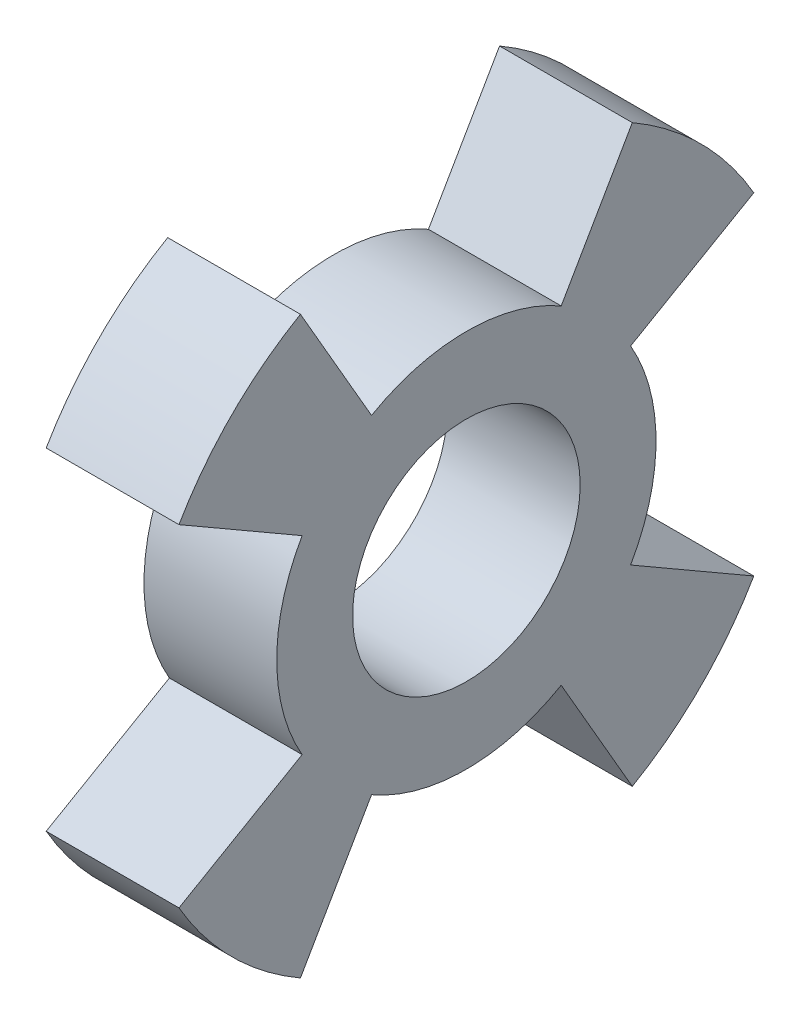
ISO-10303-21;
HEADER;
FILE_DESCRIPTION(('STEP AP214'),'2;1');
FILE_NAME('part.step','',(''),(''),'','','');
FILE_SCHEMA(('AUTOMOTIVE_DESIGN { 1 0 10303 214 1 1 1 1 }'));
ENDSEC;
DATA;
#1=APPLICATION_CONTEXT('core data for automotive mechanical design processes');
#2=APPLICATION_PROTOCOL_DEFINITION('international standard','automotive_design',2000,#1);
#3=PRODUCT_CONTEXT('',#1,'mechanical');
#4=PRODUCT('Part','Part','',(#3));
#5=PRODUCT_RELATED_PRODUCT_CATEGORY('part','',(#4));
#6=PRODUCT_DEFINITION_FORMATION('','',#4);
#7=PRODUCT_DEFINITION_CONTEXT('part definition',#1,'design');
#8=PRODUCT_DEFINITION('design','',#6,#7);
#9=PRODUCT_DEFINITION_SHAPE('','',#8);
#10=(LENGTH_UNIT() NAMED_UNIT(*) SI_UNIT(.MILLI.,.METRE.));
#11=(NAMED_UNIT(*) PLANE_ANGLE_UNIT() SI_UNIT($,.RADIAN.));
#12=(NAMED_UNIT(*) SI_UNIT($,.STERADIAN.) SOLID_ANGLE_UNIT());
#13=UNCERTAINTY_MEASURE_WITH_UNIT(LENGTH_MEASURE(1.E-05),#10,'distance_accuracy_value','');
#14=(GEOMETRIC_REPRESENTATION_CONTEXT(3) GLOBAL_UNCERTAINTY_ASSIGNED_CONTEXT((#13)) GLOBAL_UNIT_ASSIGNED_CONTEXT((#10,
#11,#12)) REPRESENTATION_CONTEXT('',''));
#15=CARTESIAN_POINT('',(0.,0.,0.));
#16=DIRECTION('',(0.,0.,1.));
#17=DIRECTION('',(1.,0.,0.));
#18=AXIS2_PLACEMENT_3D('',#15,#16,#17);
#19=CARTESIAN_POINT('',(14.,0.,0.));
#20=DIRECTION('',(-1.,0.,0.));
#21=DIRECTION('',(0.,0.,1.));
#22=AXIS2_PLACEMENT_3D('',#19,#20,#21);
#23=CYLINDRICAL_SURFACE('',#22,35.);
#24=DIRECTION('',(-1.,0.,0.));
#25=VECTOR('',#24,1.);
#26=CARTESIAN_POINT('',(14.,-30.3108891324554,-17.5));
#27=LINE('',#26,#25);
#28=CARTESIAN_POINT('',(14.,-30.3108891324554,-17.5));
#29=VERTEX_POINT('',#28);
#30=CARTESIAN_POINT('',(0.,-30.3108891324554,-17.5));
#31=VERTEX_POINT('',#30);
#32=EDGE_CURVE('E239',#29,#31,#27,.T.);
#33=ORIENTED_EDGE('',*,*,#32,.T.);
#34=CARTESIAN_POINT('',(0.,0.,0.));
#35=DIRECTION('',(1.,0.,0.));
#36=DIRECTION('',(0.,0.,-1.));
#37=AXIS2_PLACEMENT_3D('',#34,#35,#36);
#38=CIRCLE('',#37,35.);
#39=CARTESIAN_POINT('',(0.,-17.5,-30.3108891324554));
#40=VERTEX_POINT('',#39);
#41=EDGE_CURVE('E183',#31,#40,#38,.T.);
#42=ORIENTED_EDGE('',*,*,#41,.T.);
#43=DIRECTION('',(-1.,0.,0.));
#44=VECTOR('',#43,1.);
#45=CARTESIAN_POINT('',(14.,-17.5,-30.3108891324553));
#46=LINE('',#45,#44);
#47=CARTESIAN_POINT('',(14.,-17.5,-30.3108891324553));
#48=VERTEX_POINT('',#47);
#49=EDGE_CURVE('E50',#48,#40,#46,.T.);
#50=ORIENTED_EDGE('',*,*,#49,.F.);
#51=CARTESIAN_POINT('',(14.,0.,0.));
#52=DIRECTION('',(1.,0.,0.));
#53=DIRECTION('',(0.,0.,-1.));
#54=AXIS2_PLACEMENT_3D('',#51,#52,#53);
#55=CIRCLE('',#54,35.);
#56=EDGE_CURVE('E43',#29,#48,#55,.T.);
#57=ORIENTED_EDGE('',*,*,#56,.F.);
#58=EDGE_LOOP('',(#33,#42,#50,#57));
#59=FACE_BOUND('',#58,.T.);
#60=ADVANCED_FACE('F33',(#59),#23,.T.);
#61=DIRECTION('',(-1.,0.,0.));
#62=VECTOR('',#61,1.);
#63=CARTESIAN_POINT('',(14.,-30.3108891324553,17.5));
#64=LINE('',#63,#62);
#65=CARTESIAN_POINT('',(14.,-30.3108891324553,17.5));
#66=VERTEX_POINT('',#65);
#67=CARTESIAN_POINT('',(0.,-30.3108891324554,17.5));
#68=VERTEX_POINT('',#67);
#69=EDGE_CURVE('E58',#66,#68,#64,.T.);
#70=ORIENTED_EDGE('',*,*,#69,.F.);
#71=CARTESIAN_POINT('',(14.,-17.5,30.3108891324553));
#72=VERTEX_POINT('',#71);
#73=EDGE_CURVE('E169',#72,#66,#55,.T.);
#74=ORIENTED_EDGE('',*,*,#73,.F.);
#75=DIRECTION('',(-1.,0.,0.));
#76=VECTOR('',#75,1.);
#77=CARTESIAN_POINT('',(14.,-17.5,30.3108891324553));
#78=LINE('',#77,#76);
#79=CARTESIAN_POINT('',(0.,-17.5,30.3108891324553));
#80=VERTEX_POINT('',#79);
#81=EDGE_CURVE('E149',#72,#80,#78,.T.);
#82=ORIENTED_EDGE('',*,*,#81,.T.);
#83=EDGE_CURVE('E189',#80,#68,#38,.T.);
#84=ORIENTED_EDGE('',*,*,#83,.T.);
#85=EDGE_LOOP('',(#70,#74,#82,#84));
#86=FACE_BOUND('',#85,.T.);
#87=ADVANCED_FACE('F174',(#86),#23,.T.);
#88=DIRECTION('',(-1.,0.,0.));
#89=VECTOR('',#88,1.);
#90=CARTESIAN_POINT('',(14.,17.5,-30.3108891324553));
#91=LINE('',#90,#89);
#92=CARTESIAN_POINT('',(14.,17.5,-30.3108891324553));
#93=VERTEX_POINT('',#92);
#94=CARTESIAN_POINT('',(0.,17.5,-30.3108891324553));
#95=VERTEX_POINT('',#94);
#96=EDGE_CURVE('E218',#93,#95,#91,.T.);
#97=ORIENTED_EDGE('',*,*,#96,.T.);
#98=CARTESIAN_POINT('',(0.,30.3108891324554,-17.5));
#99=VERTEX_POINT('',#98);
#100=EDGE_CURVE('E177',#95,#99,#38,.T.);
#101=ORIENTED_EDGE('',*,*,#100,.T.);
#102=DIRECTION('',(-1.,0.,0.));
#103=VECTOR('',#102,1.);
#104=CARTESIAN_POINT('',(14.,30.3108891324553,-17.5));
#105=LINE('',#104,#103);
#106=CARTESIAN_POINT('',(14.,30.3108891324553,-17.5));
#107=VERTEX_POINT('',#106);
#108=EDGE_CURVE('E203',#107,#99,#105,.T.);
#109=ORIENTED_EDGE('',*,*,#108,.F.);
#110=EDGE_CURVE('E11',#93,#107,#55,.T.);
#111=ORIENTED_EDGE('',*,*,#110,.F.);
#112=EDGE_LOOP('',(#97,#101,#109,#111));
#113=FACE_BOUND('',#112,.T.);
#114=ADVANCED_FACE('F302',(#113),#23,.T.);
#115=DIRECTION('',(-1.,0.,0.));
#116=VECTOR('',#115,1.);
#117=CARTESIAN_POINT('',(14.,17.5,30.3108891324553));
#118=LINE('',#117,#116);
#119=CARTESIAN_POINT('',(14.,17.5,30.3108891324553));
#120=VERTEX_POINT('',#119);
#121=CARTESIAN_POINT('',(0.,17.5,30.3108891324554));
#122=VERTEX_POINT('',#121);
#123=EDGE_CURVE('E266',#120,#122,#118,.T.);
#124=ORIENTED_EDGE('',*,*,#123,.F.);
#125=CARTESIAN_POINT('',(14.,30.3108891324553,17.5));
#126=VERTEX_POINT('',#125);
#127=EDGE_CURVE('E41',#126,#120,#55,.T.);
#128=ORIENTED_EDGE('',*,*,#127,.F.);
#129=DIRECTION('',(-1.,0.,0.));
#130=VECTOR('',#129,1.);
#131=CARTESIAN_POINT('',(14.,30.3108891324553,17.5));
#132=LINE('',#131,#130);
#133=CARTESIAN_POINT('',(0.,30.3108891324553,17.5));
#134=VERTEX_POINT('',#133);
#135=EDGE_CURVE('E179',#126,#134,#132,.T.);
#136=ORIENTED_EDGE('',*,*,#135,.T.);
#137=EDGE_CURVE('E182',#134,#122,#38,.T.);
#138=ORIENTED_EDGE('',*,*,#137,.T.);
#139=EDGE_LOOP('',(#124,#128,#136,#138));
#140=FACE_BOUND('',#139,.T.);
#141=ADVANCED_FACE('F298',(#140),#23,.T.);
#142=CARTESIAN_POINT('',(14.,0.,0.));
#143=DIRECTION('',(1.,0.,0.));
#144=DIRECTION('',(0.,0.,-1.));
#145=AXIS2_PLACEMENT_3D('',#142,#143,#144);
#146=PLANE('',#145);
#147=CARTESIAN_POINT('',(14.,0.,0.));
#148=DIRECTION('',(1.,0.,0.));
#149=DIRECTION('',(0.,0.,-1.));
#150=AXIS2_PLACEMENT_3D('',#147,#148,#149);
#151=CIRCLE('',#150,12.);
#152=CARTESIAN_POINT('',(14.,0.,-12.));
#153=VERTEX_POINT('',#152);
#154=EDGE_CURVE('E277',#153,#153,#151,.T.);
#155=ORIENTED_EDGE('',*,*,#154,.F.);
#156=EDGE_LOOP('',(#155));
#157=FACE_BOUND('',#156,.T.);
#158=CARTESIAN_POINT('',(14.,0.,0.));
#159=DIRECTION('',(-1.,0.,0.));
#160=DIRECTION('',(0.,0.,-1.));
#161=AXIS2_PLACEMENT_3D('',#158,#159,#160);
#162=CIRCLE('',#161,20.);
#163=CARTESIAN_POINT('',(14.,-17.3205080756888,-10.));
#164=VERTEX_POINT('',#163);
#165=CARTESIAN_POINT('',(14.,-17.3205080756888,10.));
#166=VERTEX_POINT('',#165);
#167=EDGE_CURVE('E260',#164,#166,#162,.T.);
#168=ORIENTED_EDGE('',*,*,#167,.F.);
#169=DIRECTION('',(0.,0.866025403784439,0.5));
#170=VECTOR('',#169,1.);
#171=CARTESIAN_POINT('',(14.,-30.3108891324554,-17.5));
#172=LINE('',#171,#170);
#173=EDGE_CURVE('E253',#29,#164,#172,.T.);
#174=ORIENTED_EDGE('',*,*,#173,.F.);
#175=ORIENTED_EDGE('',*,*,#56,.T.);
#176=DIRECTION('',(0.,-0.500000000000001,-0.866025403784438));
#177=VECTOR('',#176,1.);
#178=CARTESIAN_POINT('',(14.,-17.5,-30.3108891324553));
#179=LINE('',#178,#177);
#180=CARTESIAN_POINT('',(14.,-10.,-17.3205080756888));
#181=VERTEX_POINT('',#180);
#182=EDGE_CURVE('E229',#181,#48,#179,.T.);
#183=ORIENTED_EDGE('',*,*,#182,.F.);
#184=CARTESIAN_POINT('',(14.,0.,0.));
#185=DIRECTION('',(-1.,0.,0.));
#186=DIRECTION('',(0.,0.,-1.));
#187=AXIS2_PLACEMENT_3D('',#184,#185,#186);
#188=CIRCLE('',#187,20.);
#189=CARTESIAN_POINT('',(14.,10.,-17.3205080756888));
#190=VERTEX_POINT('',#189);
#191=EDGE_CURVE('E241',#190,#181,#188,.T.);
#192=ORIENTED_EDGE('',*,*,#191,.F.);
#193=DIRECTION('',(0.,-0.500000000000001,0.866025403784438));
#194=VECTOR('',#193,1.);
#195=CARTESIAN_POINT('',(14.,17.5,-30.3108891324553));
#196=LINE('',#195,#194);
#197=EDGE_CURVE('E232',#93,#190,#196,.T.);
#198=ORIENTED_EDGE('',*,*,#197,.F.);
#199=ORIENTED_EDGE('',*,*,#110,.T.);
#200=DIRECTION('',(0.,0.866025403784438,-0.500000000000001));
#201=VECTOR('',#200,1.);
#202=CARTESIAN_POINT('',(14.,30.3108891324553,-17.5));
#203=LINE('',#202,#201);
#204=CARTESIAN_POINT('',(14.,17.3205080756888,-10.));
#205=VERTEX_POINT('',#204);
#206=EDGE_CURVE('E207',#205,#107,#203,.T.);
#207=ORIENTED_EDGE('',*,*,#206,.F.);
#208=CARTESIAN_POINT('',(14.,0.,0.));
#209=DIRECTION('',(-1.,0.,0.));
#210=DIRECTION('',(0.,0.,-1.));
#211=AXIS2_PLACEMENT_3D('',#208,#209,#210);
#212=CIRCLE('',#211,20.);
#213=CARTESIAN_POINT('',(14.,17.3205080756888,10.));
#214=VERTEX_POINT('',#213);
#215=EDGE_CURVE('E220',#214,#205,#212,.T.);
#216=ORIENTED_EDGE('',*,*,#215,.F.);
#217=DIRECTION('',(0.,-0.866025403784438,-0.500000000000001));
#218=VECTOR('',#217,1.);
#219=CARTESIAN_POINT('',(14.,30.3108891324553,17.5));
#220=LINE('',#219,#218);
#221=EDGE_CURVE('E211',#126,#214,#220,.T.);
#222=ORIENTED_EDGE('',*,*,#221,.F.);
#223=ORIENTED_EDGE('',*,*,#127,.T.);
#224=DIRECTION('',(0.,0.500000000000001,0.866025403784438));
#225=VECTOR('',#224,1.);
#226=CARTESIAN_POINT('',(14.,17.5,30.3108891324553));
#227=LINE('',#226,#225);
#228=CARTESIAN_POINT('',(14.,10.,17.3205080756888));
#229=VERTEX_POINT('',#228);
#230=EDGE_CURVE('E268',#229,#120,#227,.T.);
#231=ORIENTED_EDGE('',*,*,#230,.F.);
#232=CARTESIAN_POINT('',(14.,0.,0.));
#233=DIRECTION('',(-1.,0.,0.));
#234=DIRECTION('',(0.,0.,-1.));
#235=AXIS2_PLACEMENT_3D('',#232,#233,#234);
#236=CIRCLE('',#235,20.);
#237=CARTESIAN_POINT('',(14.,-10.,17.3205080756888));
#238=VERTEX_POINT('',#237);
#239=EDGE_CURVE('E171',#238,#229,#236,.T.);
#240=ORIENTED_EDGE('',*,*,#239,.F.);
#241=DIRECTION('',(0.,0.500000000000001,-0.866025403784438));
#242=VECTOR('',#241,1.);
#243=CARTESIAN_POINT('',(14.,-17.5,30.3108891324553));
#244=LINE('',#243,#242);
#245=EDGE_CURVE('E152',#72,#238,#244,.T.);
#246=ORIENTED_EDGE('',*,*,#245,.F.);
#247=ORIENTED_EDGE('',*,*,#73,.T.);
#248=DIRECTION('',(0.,-0.866025403784439,0.5));
#249=VECTOR('',#248,1.);
#250=CARTESIAN_POINT('',(14.,-30.3108891324553,17.5));
#251=LINE('',#250,#249);
#252=EDGE_CURVE('E250',#166,#66,#251,.T.);
#253=ORIENTED_EDGE('',*,*,#252,.F.);
#254=EDGE_LOOP('',(#168,#174,#175,#183,#192,#198,#199,#207,#216,#222,#223,#231,#240,#246,#247,#253));
#255=FACE_BOUND('',#254,.T.);
#256=ADVANCED_FACE('F167',(#157,#255),#146,.T.);
#257=CARTESIAN_POINT('',(0.,0.,0.));
#258=DIRECTION('',(1.,0.,0.));
#259=DIRECTION('',(0.,0.,-1.));
#260=AXIS2_PLACEMENT_3D('',#257,#258,#259);
#261=PLANE('',#260);
#262=CARTESIAN_POINT('',(0.,0.,0.));
#263=DIRECTION('',(1.,0.,0.));
#264=DIRECTION('',(0.,0.,-1.));
#265=AXIS2_PLACEMENT_3D('',#262,#263,#264);
#266=CIRCLE('',#265,12.);
#267=CARTESIAN_POINT('',(0.,0.,-12.));
#268=VERTEX_POINT('',#267);
#269=EDGE_CURVE('E36',#268,#268,#266,.T.);
#270=ORIENTED_EDGE('',*,*,#269,.T.);
#271=EDGE_LOOP('',(#270));
#272=FACE_BOUND('',#271,.T.);
#273=DIRECTION('',(0.,0.866025403784439,0.5));
#274=VECTOR('',#273,1.);
#275=CARTESIAN_POINT('',(0.,-30.3108891324554,-17.5));
#276=LINE('',#275,#274);
#277=CARTESIAN_POINT('',(0.,-17.3205080756888,-10.));
#278=VERTEX_POINT('',#277);
#279=EDGE_CURVE('E160',#31,#278,#276,.T.);
#280=ORIENTED_EDGE('',*,*,#279,.T.);
#281=CARTESIAN_POINT('',(0.,0.,0.));
#282=DIRECTION('',(-1.,0.,0.));
#283=DIRECTION('',(0.,0.,-1.));
#284=AXIS2_PLACEMENT_3D('',#281,#282,#283);
#285=CIRCLE('',#284,20.);
#286=CARTESIAN_POINT('',(0.,-17.3205080756888,10.));
#287=VERTEX_POINT('',#286);
#288=EDGE_CURVE('E254',#278,#287,#285,.T.);
#289=ORIENTED_EDGE('',*,*,#288,.T.);
#290=DIRECTION('',(0.,-0.866025403784439,0.5));
#291=VECTOR('',#290,1.);
#292=CARTESIAN_POINT('',(0.,-30.3108891324553,17.5));
#293=LINE('',#292,#291);
#294=EDGE_CURVE('E251',#287,#68,#293,.T.);
#295=ORIENTED_EDGE('',*,*,#294,.T.);
#296=ORIENTED_EDGE('',*,*,#83,.F.);
#297=DIRECTION('',(0.,0.500000000000001,-0.866025403784438));
#298=VECTOR('',#297,1.);
#299=CARTESIAN_POINT('',(0.,-17.5,30.3108891324553));
#300=LINE('',#299,#298);
#301=CARTESIAN_POINT('',(0.,-10.,17.3205080756888));
#302=VERTEX_POINT('',#301);
#303=EDGE_CURVE('E155',#80,#302,#300,.T.);
#304=ORIENTED_EDGE('',*,*,#303,.T.);
#305=CARTESIAN_POINT('',(0.,0.,0.));
#306=DIRECTION('',(-1.,0.,0.));
#307=DIRECTION('',(0.,0.,-1.));
#308=AXIS2_PLACEMENT_3D('',#305,#306,#307);
#309=CIRCLE('',#308,20.);
#310=CARTESIAN_POINT('',(0.,10.,17.3205080756888));
#311=VERTEX_POINT('',#310);
#312=EDGE_CURVE('E271',#302,#311,#309,.T.);
#313=ORIENTED_EDGE('',*,*,#312,.T.);
#314=DIRECTION('',(0.,0.500000000000001,0.866025403784438));
#315=VECTOR('',#314,1.);
#316=CARTESIAN_POINT('',(0.,17.5,30.3108891324553));
#317=LINE('',#316,#315);
#318=EDGE_CURVE('E172',#311,#122,#317,.T.);
#319=ORIENTED_EDGE('',*,*,#318,.T.);
#320=ORIENTED_EDGE('',*,*,#137,.F.);
#321=DIRECTION('',(0.,-0.866025403784438,-0.500000000000001));
#322=VECTOR('',#321,1.);
#323=CARTESIAN_POINT('',(0.,30.3108891324553,17.5));
#324=LINE('',#323,#322);
#325=CARTESIAN_POINT('',(0.,17.3205080756888,10.));
#326=VERTEX_POINT('',#325);
#327=EDGE_CURVE('E215',#134,#326,#324,.T.);
#328=ORIENTED_EDGE('',*,*,#327,.T.);
#329=CARTESIAN_POINT('',(0.,0.,0.));
#330=DIRECTION('',(-1.,0.,0.));
#331=DIRECTION('',(0.,0.,-1.));
#332=AXIS2_PLACEMENT_3D('',#329,#330,#331);
#333=CIRCLE('',#332,20.);
#334=CARTESIAN_POINT('',(0.,17.3205080756888,-10.));
#335=VERTEX_POINT('',#334);
#336=EDGE_CURVE('E212',#326,#335,#333,.T.);
#337=ORIENTED_EDGE('',*,*,#336,.T.);
#338=DIRECTION('',(0.,0.866025403784438,-0.500000000000001));
#339=VECTOR('',#338,1.);
#340=CARTESIAN_POINT('',(0.,30.3108891324553,-17.5));
#341=LINE('',#340,#339);
#342=EDGE_CURVE('E208',#335,#99,#341,.T.);
#343=ORIENTED_EDGE('',*,*,#342,.T.);
#344=ORIENTED_EDGE('',*,*,#100,.F.);
#345=DIRECTION('',(0.,-0.500000000000001,0.866025403784438));
#346=VECTOR('',#345,1.);
#347=CARTESIAN_POINT('',(0.,17.5,-30.3108891324553));
#348=LINE('',#347,#346);
#349=CARTESIAN_POINT('',(0.,10.,-17.3205080756888));
#350=VERTEX_POINT('',#349);
#351=EDGE_CURVE('E236',#95,#350,#348,.T.);
#352=ORIENTED_EDGE('',*,*,#351,.T.);
#353=CARTESIAN_POINT('',(0.,0.,0.));
#354=DIRECTION('',(-1.,0.,0.));
#355=DIRECTION('',(0.,0.,-1.));
#356=AXIS2_PLACEMENT_3D('',#353,#354,#355);
#357=CIRCLE('',#356,20.);
#358=CARTESIAN_POINT('',(0.,-10.,-17.3205080756888));
#359=VERTEX_POINT('',#358);
#360=EDGE_CURVE('E233',#350,#359,#357,.T.);
#361=ORIENTED_EDGE('',*,*,#360,.T.);
#362=DIRECTION('',(0.,-0.500000000000001,-0.866025403784438));
#363=VECTOR('',#362,1.);
#364=CARTESIAN_POINT('',(0.,-17.5,-30.3108891324553));
#365=LINE('',#364,#363);
#366=EDGE_CURVE('E230',#359,#40,#365,.T.);
#367=ORIENTED_EDGE('',*,*,#366,.T.);
#368=ORIENTED_EDGE('',*,*,#41,.F.);
#369=EDGE_LOOP('',(#280,#289,#295,#296,#304,#313,#319,#320,#328,#337,#343,#344,#352,#361,#367,#368));
#370=FACE_BOUND('',#369,.T.);
#371=ADVANCED_FACE('F284',(#272,#370),#261,.F.);
#372=CARTESIAN_POINT('',(14.,30.3108891324553,17.5));
#373=DIRECTION('',(0.,0.500000000000001,-0.866025403784438));
#374=DIRECTION('',(0.,0.866025403784438,0.500000000000001));
#375=AXIS2_PLACEMENT_3D('',#372,#373,#374);
#376=PLANE('',#375);
#377=ORIENTED_EDGE('',*,*,#327,.F.);
#378=ORIENTED_EDGE('',*,*,#135,.F.);
#379=ORIENTED_EDGE('',*,*,#221,.T.);
#380=DIRECTION('',(-1.,0.,0.));
#381=VECTOR('',#380,1.);
#382=CARTESIAN_POINT('',(14.,17.3205080756888,10.));
#383=LINE('',#382,#381);
#384=EDGE_CURVE('E195',#214,#326,#383,.T.);
#385=ORIENTED_EDGE('',*,*,#384,.T.);
#386=EDGE_LOOP('',(#377,#378,#379,#385));
#387=FACE_BOUND('',#386,.T.);
#388=ADVANCED_FACE('F316',(#387),#376,.T.);
#389=CARTESIAN_POINT('',(14.,0.,0.));
#390=DIRECTION('',(-1.,0.,0.));
#391=DIRECTION('',(0.,0.,1.));
#392=AXIS2_PLACEMENT_3D('',#389,#390,#391);
#393=CYLINDRICAL_SURFACE('',#392,20.);
#394=ORIENTED_EDGE('',*,*,#336,.F.);
#395=ORIENTED_EDGE('',*,*,#384,.F.);
#396=ORIENTED_EDGE('',*,*,#215,.T.);
#397=DIRECTION('',(-1.,0.,0.));
#398=VECTOR('',#397,1.);
#399=CARTESIAN_POINT('',(14.,17.3205080756888,-10.));
#400=LINE('',#399,#398);
#401=EDGE_CURVE('E199',#205,#335,#400,.T.);
#402=ORIENTED_EDGE('',*,*,#401,.T.);
#403=EDGE_LOOP('',(#394,#395,#396,#402));
#404=FACE_BOUND('',#403,.T.);
#405=ADVANCED_FACE('F318',(#404),#393,.T.);
#406=CARTESIAN_POINT('',(14.,30.3108891324553,-17.5));
#407=DIRECTION('',(0.,0.500000000000001,0.866025403784438));
#408=DIRECTION('',(0.,-0.866025403784438,0.500000000000001));
#409=AXIS2_PLACEMENT_3D('',#406,#407,#408);
#410=PLANE('',#409);
#411=ORIENTED_EDGE('',*,*,#342,.F.);
#412=ORIENTED_EDGE('',*,*,#401,.F.);
#413=ORIENTED_EDGE('',*,*,#206,.T.);
#414=ORIENTED_EDGE('',*,*,#108,.T.);
#415=EDGE_LOOP('',(#411,#412,#413,#414));
#416=FACE_BOUND('',#415,.T.);
#417=ADVANCED_FACE('F347',(#416),#410,.T.);
#418=CARTESIAN_POINT('',(14.,-17.5,30.3108891324553));
#419=DIRECTION('',(0.,0.866025403784438,0.500000000000001));
#420=DIRECTION('',(0.,-0.500000000000001,0.866025403784438));
#421=AXIS2_PLACEMENT_3D('',#418,#419,#420);
#422=PLANE('',#421);
#423=ORIENTED_EDGE('',*,*,#303,.F.);
#424=ORIENTED_EDGE('',*,*,#81,.F.);
#425=ORIENTED_EDGE('',*,*,#245,.T.);
#426=DIRECTION('',(-1.,0.,0.));
#427=VECTOR('',#426,1.);
#428=CARTESIAN_POINT('',(14.,-10.,17.3205080756888));
#429=LINE('',#428,#427);
#430=EDGE_CURVE('E161',#238,#302,#429,.T.);
#431=ORIENTED_EDGE('',*,*,#430,.T.);
#432=EDGE_LOOP('',(#423,#424,#425,#431));
#433=FACE_BOUND('',#432,.T.);
#434=ADVANCED_FACE('F151',(#433),#422,.T.);
#435=CARTESIAN_POINT('',(14.,0.,0.));
#436=DIRECTION('',(-1.,0.,0.));
#437=DIRECTION('',(0.,0.,1.));
#438=AXIS2_PLACEMENT_3D('',#435,#436,#437);
#439=CYLINDRICAL_SURFACE('',#438,20.);
#440=ORIENTED_EDGE('',*,*,#312,.F.);
#441=ORIENTED_EDGE('',*,*,#430,.F.);
#442=ORIENTED_EDGE('',*,*,#239,.T.);
#443=DIRECTION('',(-1.,0.,0.));
#444=VECTOR('',#443,1.);
#445=CARTESIAN_POINT('',(14.,10.,17.3205080756888));
#446=LINE('',#445,#444);
#447=EDGE_CURVE('E264',#229,#311,#446,.T.);
#448=ORIENTED_EDGE('',*,*,#447,.T.);
#449=EDGE_LOOP('',(#440,#441,#442,#448));
#450=FACE_BOUND('',#449,.T.);
#451=ADVANCED_FACE('F325',(#450),#439,.T.);
#452=CARTESIAN_POINT('',(14.,17.5,30.3108891324553));
#453=DIRECTION('',(0.,-0.866025403784438,0.500000000000001));
#454=DIRECTION('',(0.,-0.500000000000001,-0.866025403784438));
#455=AXIS2_PLACEMENT_3D('',#452,#453,#454);
#456=PLANE('',#455);
#457=ORIENTED_EDGE('',*,*,#318,.F.);
#458=ORIENTED_EDGE('',*,*,#447,.F.);
#459=ORIENTED_EDGE('',*,*,#230,.T.);
#460=ORIENTED_EDGE('',*,*,#123,.T.);
#461=EDGE_LOOP('',(#457,#458,#459,#460));
#462=FACE_BOUND('',#461,.T.);
#463=ADVANCED_FACE('F323',(#462),#456,.T.);
#464=CARTESIAN_POINT('',(14.,17.5,-30.3108891324553));
#465=DIRECTION('',(0.,-0.866025403784438,-0.500000000000001));
#466=DIRECTION('',(0.,0.500000000000001,-0.866025403784438));
#467=AXIS2_PLACEMENT_3D('',#464,#465,#466);
#468=PLANE('',#467);
#469=ORIENTED_EDGE('',*,*,#351,.F.);
#470=ORIENTED_EDGE('',*,*,#96,.F.);
#471=ORIENTED_EDGE('',*,*,#197,.T.);
#472=DIRECTION('',(-1.,0.,0.));
#473=VECTOR('',#472,1.);
#474=CARTESIAN_POINT('',(14.,10.,-17.3205080756888));
#475=LINE('',#474,#473);
#476=EDGE_CURVE('E224',#190,#350,#475,.T.);
#477=ORIENTED_EDGE('',*,*,#476,.T.);
#478=EDGE_LOOP('',(#469,#470,#471,#477));
#479=FACE_BOUND('',#478,.T.);
#480=ADVANCED_FACE('F345',(#479),#468,.T.);
#481=CARTESIAN_POINT('',(14.,0.,0.));
#482=DIRECTION('',(-1.,0.,0.));
#483=DIRECTION('',(0.,0.,1.));
#484=AXIS2_PLACEMENT_3D('',#481,#482,#483);
#485=CYLINDRICAL_SURFACE('',#484,20.);
#486=ORIENTED_EDGE('',*,*,#360,.F.);
#487=ORIENTED_EDGE('',*,*,#476,.F.);
#488=ORIENTED_EDGE('',*,*,#191,.T.);
#489=DIRECTION('',(-1.,0.,0.));
#490=VECTOR('',#489,1.);
#491=CARTESIAN_POINT('',(14.,-10.,-17.3205080756888));
#492=LINE('',#491,#490);
#493=EDGE_CURVE('E226',#181,#359,#492,.T.);
#494=ORIENTED_EDGE('',*,*,#493,.T.);
#495=EDGE_LOOP('',(#486,#487,#488,#494));
#496=FACE_BOUND('',#495,.T.);
#497=ADVANCED_FACE('F343',(#496),#485,.T.);
#498=CARTESIAN_POINT('',(14.,-17.5,-30.3108891324553));
#499=DIRECTION('',(0.,0.866025403784438,-0.500000000000001));
#500=DIRECTION('',(0.,0.500000000000001,0.866025403784438));
#501=AXIS2_PLACEMENT_3D('',#498,#499,#500);
#502=PLANE('',#501);
#503=ORIENTED_EDGE('',*,*,#366,.F.);
#504=ORIENTED_EDGE('',*,*,#493,.F.);
#505=ORIENTED_EDGE('',*,*,#182,.T.);
#506=ORIENTED_EDGE('',*,*,#49,.T.);
#507=EDGE_LOOP('',(#503,#504,#505,#506));
#508=FACE_BOUND('',#507,.T.);
#509=ADVANCED_FACE('F336',(#508),#502,.T.);
#510=CARTESIAN_POINT('',(14.,-30.3108891324554,-17.5));
#511=DIRECTION('',(0.,-0.5,0.866025403784438));
#512=DIRECTION('',(0.,-0.866025403784439,-0.5));
#513=AXIS2_PLACEMENT_3D('',#510,#511,#512);
#514=PLANE('',#513);
#515=ORIENTED_EDGE('',*,*,#279,.F.);
#516=ORIENTED_EDGE('',*,*,#32,.F.);
#517=ORIENTED_EDGE('',*,*,#173,.T.);
#518=DIRECTION('',(-1.,0.,0.));
#519=VECTOR('',#518,1.);
#520=CARTESIAN_POINT('',(14.,-17.3205080756888,-10.));
#521=LINE('',#520,#519);
#522=EDGE_CURVE('E245',#164,#278,#521,.T.);
#523=ORIENTED_EDGE('',*,*,#522,.T.);
#524=EDGE_LOOP('',(#515,#516,#517,#523));
#525=FACE_BOUND('',#524,.T.);
#526=ADVANCED_FACE('F333',(#525),#514,.T.);
#527=CARTESIAN_POINT('',(14.,0.,0.));
#528=DIRECTION('',(-1.,0.,0.));
#529=DIRECTION('',(0.,0.,1.));
#530=AXIS2_PLACEMENT_3D('',#527,#528,#529);
#531=CYLINDRICAL_SURFACE('',#530,20.);
#532=ORIENTED_EDGE('',*,*,#288,.F.);
#533=ORIENTED_EDGE('',*,*,#522,.F.);
#534=ORIENTED_EDGE('',*,*,#167,.T.);
#535=DIRECTION('',(-1.,0.,0.));
#536=VECTOR('',#535,1.);
#537=CARTESIAN_POINT('',(14.,-17.3205080756888,10.));
#538=LINE('',#537,#536);
#539=EDGE_CURVE('E247',#166,#287,#538,.T.);
#540=ORIENTED_EDGE('',*,*,#539,.T.);
#541=EDGE_LOOP('',(#532,#533,#534,#540));
#542=FACE_BOUND('',#541,.T.);
#543=ADVANCED_FACE('F294',(#542),#531,.T.);
#544=CARTESIAN_POINT('',(14.,-30.3108891324553,17.5));
#545=DIRECTION('',(0.,-0.5,-0.866025403784438));
#546=DIRECTION('',(0.,0.866025403784438,-0.5));
#547=AXIS2_PLACEMENT_3D('',#544,#545,#546);
#548=PLANE('',#547);
#549=ORIENTED_EDGE('',*,*,#294,.F.);
#550=ORIENTED_EDGE('',*,*,#539,.F.);
#551=ORIENTED_EDGE('',*,*,#252,.T.);
#552=ORIENTED_EDGE('',*,*,#69,.T.);
#553=EDGE_LOOP('',(#549,#550,#551,#552));
#554=FACE_BOUND('',#553,.T.);
#555=ADVANCED_FACE('F289',(#554),#548,.T.);
#556=CARTESIAN_POINT('',(-1.2E-05,0.,0.));
#557=DIRECTION('',(1.,0.,0.));
#558=DIRECTION('',(0.,0.,-1.));
#559=AXIS2_PLACEMENT_3D('',#556,#557,#558);
#560=CYLINDRICAL_SURFACE('',#559,12.);
#561=CARTESIAN_POINT('',(14.,0.,-12.));
#562=CARTESIAN_POINT('',(13.8541666666667,0.,-12.));
#563=CARTESIAN_POINT('',(13.7083333333333,0.,-12.));
#564=CARTESIAN_POINT('',(13.4166666666667,0.,-12.));
#565=CARTESIAN_POINT('',(13.2708333333333,0.,-12.));
#566=CARTESIAN_POINT('',(12.9791666666667,0.,-12.));
#567=CARTESIAN_POINT('',(12.8333333333333,0.,-12.));
#568=CARTESIAN_POINT('',(12.5416666666667,0.,-12.));
#569=CARTESIAN_POINT('',(12.3958333333333,0.,-12.));
#570=CARTESIAN_POINT('',(12.1041666666667,0.,-12.));
#571=CARTESIAN_POINT('',(11.9583333333333,0.,-12.));
#572=CARTESIAN_POINT('',(11.6666666666667,0.,-12.));
#573=CARTESIAN_POINT('',(11.5208333333333,0.,-12.));
#574=CARTESIAN_POINT('',(11.2291666666667,0.,-12.));
#575=CARTESIAN_POINT('',(11.0833333333333,0.,-12.));
#576=CARTESIAN_POINT('',(10.7916666666667,0.,-12.));
#577=CARTESIAN_POINT('',(10.6458333333333,0.,-12.));
#578=CARTESIAN_POINT('',(10.3541666666667,0.,-12.));
#579=CARTESIAN_POINT('',(10.2083333333333,0.,-12.));
#580=CARTESIAN_POINT('',(9.91666666666667,0.,-12.));
#581=CARTESIAN_POINT('',(9.77083333333333,0.,-12.));
#582=CARTESIAN_POINT('',(9.47916666666667,0.,-12.));
#583=CARTESIAN_POINT('',(9.33333333333333,0.,-12.));
#584=CARTESIAN_POINT('',(9.04166666666667,0.,-12.));
#585=CARTESIAN_POINT('',(8.89583333333333,0.,-12.));
#586=CARTESIAN_POINT('',(8.60416666666667,0.,-12.));
#587=CARTESIAN_POINT('',(8.45833333333333,0.,-12.));
#588=CARTESIAN_POINT('',(8.16666666666667,0.,-12.));
#589=CARTESIAN_POINT('',(8.02083333333333,0.,-12.));
#590=CARTESIAN_POINT('',(7.72916666666667,0.,-12.));
#591=CARTESIAN_POINT('',(7.58333333333333,0.,-12.));
#592=CARTESIAN_POINT('',(7.29166666666667,0.,-12.));
#593=CARTESIAN_POINT('',(7.14583333333333,0.,-12.));
#594=CARTESIAN_POINT('',(6.85416666666667,0.,-12.));
#595=CARTESIAN_POINT('',(6.70833333333333,0.,-12.));
#596=CARTESIAN_POINT('',(6.41666666666667,0.,-12.));
#597=CARTESIAN_POINT('',(6.27083333333333,0.,-12.));
#598=CARTESIAN_POINT('',(5.97916666666667,0.,-12.));
#599=CARTESIAN_POINT('',(5.83333333333333,0.,-12.));
#600=CARTESIAN_POINT('',(5.54166666666667,0.,-12.));
#601=CARTESIAN_POINT('',(5.39583333333333,0.,-12.));
#602=CARTESIAN_POINT('',(5.10416666666667,0.,-12.));
#603=CARTESIAN_POINT('',(4.95833333333333,0.,-12.));
#604=CARTESIAN_POINT('',(4.66666666666667,0.,-12.));
#605=CARTESIAN_POINT('',(4.52083333333333,0.,-12.));
#606=CARTESIAN_POINT('',(4.22916666666667,0.,-12.));
#607=CARTESIAN_POINT('',(4.08333333333333,0.,-12.));
#608=CARTESIAN_POINT('',(3.79166666666667,0.,-12.));
#609=CARTESIAN_POINT('',(3.64583333333333,0.,-12.));
#610=CARTESIAN_POINT('',(3.35416666666667,0.,-12.));
#611=CARTESIAN_POINT('',(3.20833333333333,0.,-12.));
#612=CARTESIAN_POINT('',(2.91666666666667,0.,-12.));
#613=CARTESIAN_POINT('',(2.77083333333333,0.,-12.));
#614=CARTESIAN_POINT('',(2.47916666666667,0.,-12.));
#615=CARTESIAN_POINT('',(2.33333333333333,0.,-12.));
#616=CARTESIAN_POINT('',(2.04166666666667,0.,-12.));
#617=CARTESIAN_POINT('',(1.89583333333333,0.,-12.));
#618=CARTESIAN_POINT('',(1.60416666666667,0.,-12.));
#619=CARTESIAN_POINT('',(1.45833333333333,0.,-12.));
#620=CARTESIAN_POINT('',(1.16666666666667,0.,-12.));
#621=CARTESIAN_POINT('',(1.02083333333333,0.,-12.));
#622=CARTESIAN_POINT('',(0.729166666666668,0.,-12.));
#623=CARTESIAN_POINT('',(0.583333333333334,0.,-12.));
#624=CARTESIAN_POINT('',(0.291666666666668,0.,-12.));
#625=CARTESIAN_POINT('',(0.145833333333334,0.,-12.));
#626=CARTESIAN_POINT('',(0.,0.,-12.));
#627=B_SPLINE_CURVE_WITH_KNOTS('',3,(#561,#562,#563,#564,#565,#566,#567,#568,#569,#570,#571,
#572,#573,#574,#575,#576,#577,#578,#579,#580,#581,#582,#583,#584,#585,#586,#587,#588,#589,#590,
#591,#592,#593,#594,#595,#596,#597,#598,#599,#600,#601,#602,#603,#604,#605,#606,#607,#608,#609,
#610,#611,#612,#613,#614,#615,#616,#617,#618,#619,#620,#621,#622,#623,#624,#625,#626),
.UNSPECIFIED.,.F.,.F.,(4,2,2,2,2,2,2,2,2,2,2,2,2,2,2,2,2,2,2,2,2,2,2,2,2,2,2,2,2,2,2,2,4),(0.,
0.4375,0.875000000000001,1.3125,1.75,2.1875,2.625,3.0625,3.5,3.9375,4.375,4.8125,5.25,5.6875,
6.125,6.5625,7.,7.4375,7.875,8.3125,8.75,9.1875,9.625,10.0625,10.5,10.9375,11.375,11.8125,12.25,
12.6875,13.125,13.5625,14.),.UNSPECIFIED.);
#628=EDGE_CURVE('BSEAM287',#153,#268,#627,.T.);
#629=ORIENTED_EDGE('',*,*,#154,.T.);
#630=ORIENTED_EDGE('',*,*,#269,.F.);
#631=ORIENTED_EDGE('',*,*,#628,.T.);
#632=ORIENTED_EDGE('',*,*,#628,.F.);
#633=EDGE_LOOP('',(#629,#631,#630,#632));
#634=FACE_BOUND('',#633,.T.);
#635=ADVANCED_FACE('F287',(#634),#560,.F.);
#636=CLOSED_SHELL('',(#60,#87,#114,#141,#256,#371,#388,#405,#417,#434,#451,#463,#480,#497,#509,
#526,#543,#555,#635));
#637=MANIFOLD_SOLID_BREP('B2',#636);
#638=ADVANCED_BREP_SHAPE_REPRESENTATION('',(#18,#637),#14);
#639=SHAPE_DEFINITION_REPRESENTATION(#9,#638);
ENDSEC;
END-ISO-10303-21;
